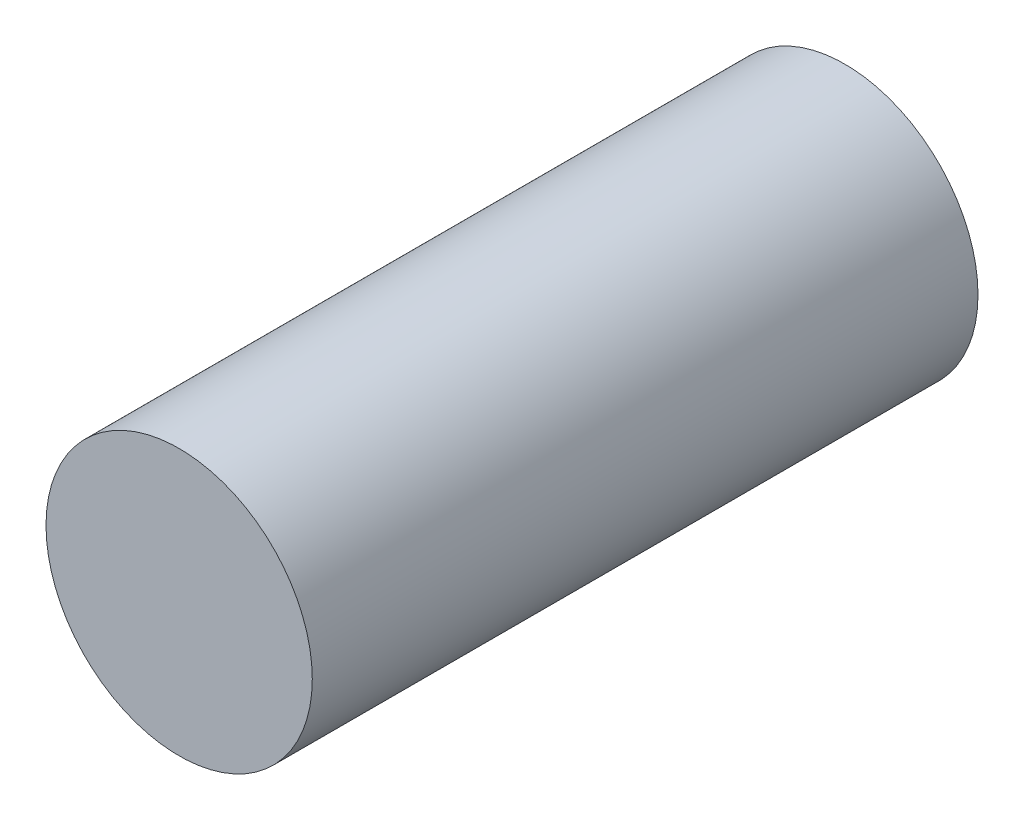
ISO-10303-21;
HEADER;
FILE_DESCRIPTION(('STEP AP214'),'2;1');
FILE_NAME('part.step','',(''),(''),'','','');
FILE_SCHEMA(('AUTOMOTIVE_DESIGN { 1 0 10303 214 1 1 1 1 }'));
ENDSEC;
DATA;
#1=APPLICATION_CONTEXT('core data for automotive mechanical design processes');
#2=APPLICATION_PROTOCOL_DEFINITION('international standard','automotive_design',2000,#1);
#3=PRODUCT_CONTEXT('',#1,'mechanical');
#4=PRODUCT('Part','Part','',(#3));
#5=PRODUCT_RELATED_PRODUCT_CATEGORY('part','',(#4));
#6=PRODUCT_DEFINITION_FORMATION('','',#4);
#7=PRODUCT_DEFINITION_CONTEXT('part definition',#1,'design');
#8=PRODUCT_DEFINITION('design','',#6,#7);
#9=PRODUCT_DEFINITION_SHAPE('','',#8);
#10=(LENGTH_UNIT() NAMED_UNIT(*) SI_UNIT(.MILLI.,.METRE.));
#11=(NAMED_UNIT(*) PLANE_ANGLE_UNIT() SI_UNIT($,.RADIAN.));
#12=(NAMED_UNIT(*) SI_UNIT($,.STERADIAN.) SOLID_ANGLE_UNIT());
#13=UNCERTAINTY_MEASURE_WITH_UNIT(LENGTH_MEASURE(1.E-05),#10,'distance_accuracy_value','');
#14=(GEOMETRIC_REPRESENTATION_CONTEXT(3) GLOBAL_UNCERTAINTY_ASSIGNED_CONTEXT((#13)) GLOBAL_UNIT_ASSIGNED_CONTEXT((#10,
#11,#12)) REPRESENTATION_CONTEXT('',''));
#15=CARTESIAN_POINT('',(0.,0.,0.));
#16=DIRECTION('',(0.,0.,1.));
#17=DIRECTION('',(1.,0.,0.));
#18=AXIS2_PLACEMENT_3D('',#15,#16,#17);
#19=CARTESIAN_POINT('',(0.,0.,1270.));
#20=DIRECTION('',(0.,0.,-1.));
#21=DIRECTION('',(-1.,0.,0.));
#22=AXIS2_PLACEMENT_3D('',#19,#20,#21);
#23=CYLINDRICAL_SURFACE('',#22,254.);
#24=CARTESIAN_POINT('',(0.,0.,1270.));
#25=DIRECTION('',(0.,0.,1.));
#26=DIRECTION('',(1.,0.,0.));
#27=AXIS2_PLACEMENT_3D('',#24,#25,#26);
#28=CIRCLE('',#27,254.);
#29=CARTESIAN_POINT('',(-254.,0.,1270.));
#30=VERTEX_POINT('',#29);
#31=EDGE_CURVE('E10',#30,#30,#28,.T.);
#32=CARTESIAN_POINT('',(0.,0.,0.));
#33=DIRECTION('',(0.,0.,1.));
#34=DIRECTION('',(1.,0.,0.));
#35=AXIS2_PLACEMENT_3D('',#32,#33,#34);
#36=CIRCLE('',#35,254.);
#37=CARTESIAN_POINT('',(-254.,0.,-2.22044604925031E-13));
#38=VERTEX_POINT('',#37);
#39=EDGE_CURVE('E34',#38,#38,#36,.T.);
#40=CARTESIAN_POINT('',(-254.,0.,1270.));
#41=CARTESIAN_POINT('',(-254.,0.,1256.77083333333));
#42=CARTESIAN_POINT('',(-254.,0.,1243.54166666667));
#43=CARTESIAN_POINT('',(-254.,0.,1217.08333333333));
#44=CARTESIAN_POINT('',(-254.,0.,1203.85416666667));
#45=CARTESIAN_POINT('',(-254.,0.,1177.39583333333));
#46=CARTESIAN_POINT('',(-254.,0.,1164.16666666667));
#47=CARTESIAN_POINT('',(-254.,0.,1137.70833333333));
#48=CARTESIAN_POINT('',(-254.,0.,1124.47916666667));
#49=CARTESIAN_POINT('',(-254.,0.,1098.02083333333));
#50=CARTESIAN_POINT('',(-254.,0.,1084.79166666667));
#51=CARTESIAN_POINT('',(-254.,0.,1058.33333333333));
#52=CARTESIAN_POINT('',(-254.,0.,1045.10416666667));
#53=CARTESIAN_POINT('',(-254.,0.,1018.64583333333));
#54=CARTESIAN_POINT('',(-254.,0.,1005.41666666667));
#55=CARTESIAN_POINT('',(-254.,0.,978.958333333333));
#56=CARTESIAN_POINT('',(-254.,0.,965.729166666667));
#57=CARTESIAN_POINT('',(-254.,0.,939.270833333333));
#58=CARTESIAN_POINT('',(-254.,0.,926.041666666667));
#59=CARTESIAN_POINT('',(-254.,0.,899.583333333333));
#60=CARTESIAN_POINT('',(-254.,0.,886.354166666667));
#61=CARTESIAN_POINT('',(-254.,0.,859.895833333333));
#62=CARTESIAN_POINT('',(-254.,0.,846.666666666667));
#63=CARTESIAN_POINT('',(-254.,0.,820.208333333333));
#64=CARTESIAN_POINT('',(-254.,0.,806.979166666667));
#65=CARTESIAN_POINT('',(-254.,0.,780.520833333333));
#66=CARTESIAN_POINT('',(-254.,0.,767.291666666667));
#67=CARTESIAN_POINT('',(-254.,0.,740.833333333333));
#68=CARTESIAN_POINT('',(-254.,0.,727.604166666667));
#69=CARTESIAN_POINT('',(-254.,0.,701.145833333333));
#70=CARTESIAN_POINT('',(-254.,0.,687.916666666667));
#71=CARTESIAN_POINT('',(-254.,0.,661.458333333333));
#72=CARTESIAN_POINT('',(-254.,0.,648.229166666667));
#73=CARTESIAN_POINT('',(-254.,0.,621.770833333333));
#74=CARTESIAN_POINT('',(-254.,0.,608.541666666667));
#75=CARTESIAN_POINT('',(-254.,0.,582.083333333333));
#76=CARTESIAN_POINT('',(-254.,0.,568.854166666667));
#77=CARTESIAN_POINT('',(-254.,0.,542.395833333333));
#78=CARTESIAN_POINT('',(-254.,0.,529.166666666667));
#79=CARTESIAN_POINT('',(-254.,0.,502.708333333333));
#80=CARTESIAN_POINT('',(-254.,0.,489.479166666667));
#81=CARTESIAN_POINT('',(-254.,0.,463.020833333333));
#82=CARTESIAN_POINT('',(-254.,0.,449.791666666667));
#83=CARTESIAN_POINT('',(-254.,0.,423.333333333333));
#84=CARTESIAN_POINT('',(-254.,0.,410.104166666667));
#85=CARTESIAN_POINT('',(-254.,0.,383.645833333333));
#86=CARTESIAN_POINT('',(-254.,0.,370.416666666667));
#87=CARTESIAN_POINT('',(-254.,0.,343.958333333333));
#88=CARTESIAN_POINT('',(-254.,0.,330.729166666667));
#89=CARTESIAN_POINT('',(-254.,0.,304.270833333333));
#90=CARTESIAN_POINT('',(-254.,0.,291.041666666666));
#91=CARTESIAN_POINT('',(-254.,0.,264.583333333333));
#92=CARTESIAN_POINT('',(-254.,0.,251.354166666667));
#93=CARTESIAN_POINT('',(-254.,0.,224.895833333333));
#94=CARTESIAN_POINT('',(-254.,0.,211.666666666667));
#95=CARTESIAN_POINT('',(-254.,0.,185.208333333333));
#96=CARTESIAN_POINT('',(-254.,0.,171.979166666666));
#97=CARTESIAN_POINT('',(-254.,0.,145.520833333333));
#98=CARTESIAN_POINT('',(-254.,0.,132.291666666666));
#99=CARTESIAN_POINT('',(-254.,0.,105.833333333333));
#100=CARTESIAN_POINT('',(-254.,0.,92.6041666666664));
#101=CARTESIAN_POINT('',(-254.,0.,66.1458333333331));
#102=CARTESIAN_POINT('',(-254.,0.,52.9166666666665));
#103=CARTESIAN_POINT('',(-254.,0.,26.4583333333332));
#104=CARTESIAN_POINT('',(-254.,0.,13.2291666666665));
#105=CARTESIAN_POINT('',(-254.,0.,-2.22044604925031E-13));
#106=B_SPLINE_CURVE_WITH_KNOTS('',3,(#40,#41,#42,#43,#44,#45,#46,#47,#48,#49,#50,#51,#52,#53,
#54,#55,#56,#57,#58,#59,#60,#61,#62,#63,#64,#65,#66,#67,#68,#69,#70,#71,#72,#73,#74,#75,#76,#77,
#78,#79,#80,#81,#82,#83,#84,#85,#86,#87,#88,#89,#90,#91,#92,#93,#94,#95,#96,#97,#98,#99,#100,
#101,#102,#103,#104,#105),.UNSPECIFIED.,.F.,.F.,(4,2,2,2,2,2,2,2,2,2,2,2,2,2,2,2,2,2,2,2,2,2,2,
2,2,2,2,2,2,2,2,2,4),(0.,39.6874999999999,79.375,119.0625,158.75,198.4375,238.125,277.8125,
317.5,357.1875,396.875,436.5625,476.25,515.9375,555.625,595.3125,635.,674.6875,714.375,754.0625,
793.75,833.4375,873.125,912.8125,952.5,992.1875,1031.875,1071.5625,1111.25,1150.9375,1190.625,
1230.3125,1270.),.UNSPECIFIED.);
#107=EDGE_CURVE('BSEAM31',#30,#38,#106,.T.);
#108=ORIENTED_EDGE('',*,*,#31,.F.);
#109=ORIENTED_EDGE('',*,*,#39,.T.);
#110=ORIENTED_EDGE('',*,*,#107,.T.);
#111=ORIENTED_EDGE('',*,*,#107,.F.);
#112=EDGE_LOOP('',(#108,#110,#109,#111));
#113=FACE_BOUND('',#112,.T.);
#114=ADVANCED_FACE('F31',(#113),#23,.T.);
#115=CARTESIAN_POINT('',(0.,0.,1270.));
#116=DIRECTION('',(0.,0.,1.));
#117=DIRECTION('',(1.,0.,0.));
#118=AXIS2_PLACEMENT_3D('',#115,#116,#117);
#119=PLANE('',#118);
#120=ORIENTED_EDGE('',*,*,#31,.T.);
#121=EDGE_LOOP('',(#120));
#122=FACE_BOUND('',#121,.T.);
#123=ADVANCED_FACE('F46',(#122),#119,.T.);
#124=CARTESIAN_POINT('',(0.,0.,0.));
#125=DIRECTION('',(0.,0.,1.));
#126=DIRECTION('',(1.,0.,0.));
#127=AXIS2_PLACEMENT_3D('',#124,#125,#126);
#128=PLANE('',#127);
#129=ORIENTED_EDGE('',*,*,#39,.F.);
#130=EDGE_LOOP('',(#129));
#131=FACE_BOUND('',#130,.T.);
#132=ADVANCED_FACE('F44',(#131),#128,.F.);
#133=CLOSED_SHELL('',(#114,#123,#132));
#134=MANIFOLD_SOLID_BREP('B2',#133);
#135=ADVANCED_BREP_SHAPE_REPRESENTATION('',(#18,#134),#14);
#136=SHAPE_DEFINITION_REPRESENTATION(#9,#135);
ENDSEC;
END-ISO-10303-21;
